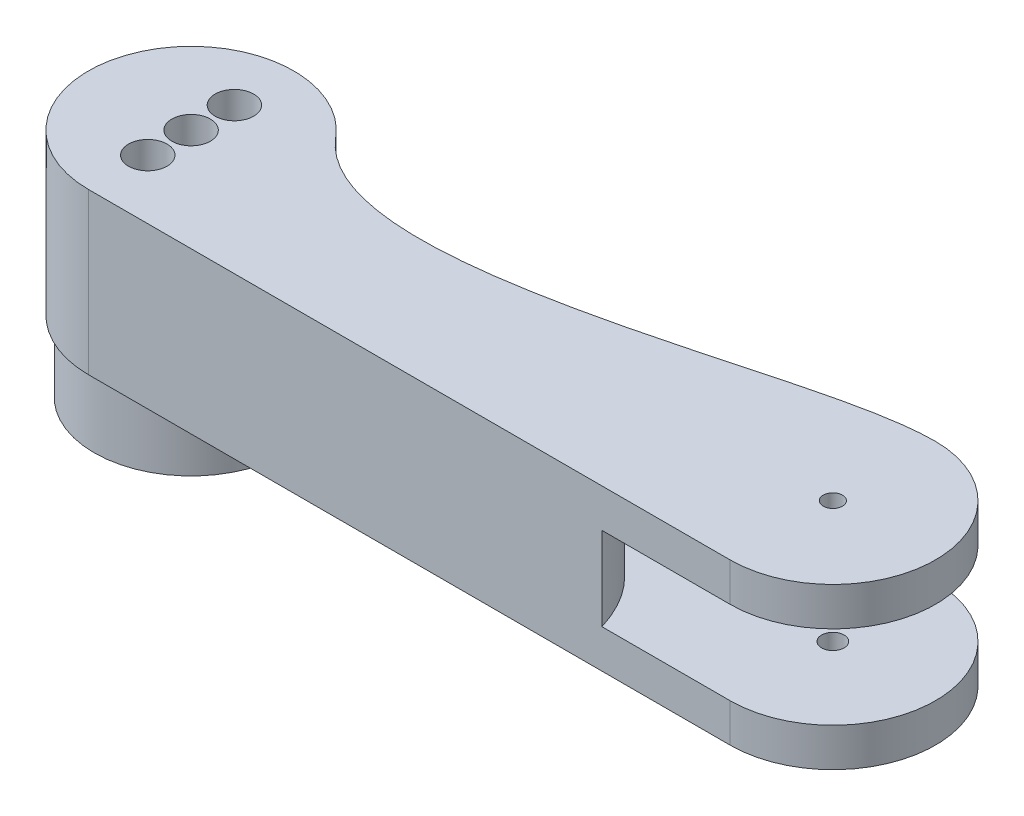
ISO-10303-21;
HEADER;
FILE_DESCRIPTION(('STEP AP214'),'2;1');
FILE_NAME('part.step','',(''),(''),'','','');
FILE_SCHEMA(('AUTOMOTIVE_DESIGN { 1 0 10303 214 1 1 1 1 }'));
ENDSEC;
DATA;
#1=APPLICATION_CONTEXT('core data for automotive mechanical design processes');
#2=APPLICATION_PROTOCOL_DEFINITION('international standard','automotive_design',2000,#1);
#3=PRODUCT_CONTEXT('',#1,'mechanical');
#4=PRODUCT('Part','Part','',(#3));
#5=PRODUCT_RELATED_PRODUCT_CATEGORY('part','',(#4));
#6=PRODUCT_DEFINITION_FORMATION('','',#4);
#7=PRODUCT_DEFINITION_CONTEXT('part definition',#1,'design');
#8=PRODUCT_DEFINITION('design','',#6,#7);
#9=PRODUCT_DEFINITION_SHAPE('','',#8);
#10=(LENGTH_UNIT() NAMED_UNIT(*) SI_UNIT(.MILLI.,.METRE.));
#11=(NAMED_UNIT(*) PLANE_ANGLE_UNIT() SI_UNIT($,.RADIAN.));
#12=(NAMED_UNIT(*) SI_UNIT($,.STERADIAN.) SOLID_ANGLE_UNIT());
#13=UNCERTAINTY_MEASURE_WITH_UNIT(LENGTH_MEASURE(1.E-05),#10,'distance_accuracy_value','');
#14=(GEOMETRIC_REPRESENTATION_CONTEXT(3) GLOBAL_UNCERTAINTY_ASSIGNED_CONTEXT((#13)) GLOBAL_UNIT_ASSIGNED_CONTEXT((#10,
#11,#12)) REPRESENTATION_CONTEXT('',''));
#15=CARTESIAN_POINT('',(0.,0.,0.));
#16=DIRECTION('',(0.,0.,1.));
#17=DIRECTION('',(1.,0.,0.));
#18=AXIS2_PLACEMENT_3D('',#15,#16,#17);
#19=CARTESIAN_POINT('',(-50.,6.,0.));
#20=DIRECTION('',(0.,1.,0.));
#21=DIRECTION('',(0.,0.,-1.));
#22=AXIS2_PLACEMENT_3D('',#19,#20,#21);
#23=PLANE('',#22);
#24=CARTESIAN_POINT('',(50.,6.,0.));
#25=DIRECTION('',(0.,1.,0.));
#26=DIRECTION('',(0.,0.,1.));
#27=AXIS2_PLACEMENT_3D('',#24,#25,#26);
#28=CIRCLE('',#27,1.75);
#29=CARTESIAN_POINT('',(50.,6.,1.75000000000002));
#30=VERTEX_POINT('',#29);
#31=EDGE_CURVE('E248',#30,#30,#28,.T.);
#32=ORIENTED_EDGE('',*,*,#31,.F.);
#33=EDGE_LOOP('',(#32));
#34=FACE_BOUND('',#33,.T.);
#35=CARTESIAN_POINT('',(-34.2856764118283,6.,-16.));
#36=CARTESIAN_POINT('',(-23.6762783257379,6.,6.11814593544332));
#37=CARTESIAN_POINT('',(21.9928600173767,6.,-10.8621580125102));
#38=CARTESIAN_POINT('',(30.,6.,16.));
#39=B_SPLINE_CURVE_WITH_KNOTS('',3,(#35,#36,#37,#38),.UNSPECIFIED.,.F.,.F.,(4,4),(0.,1.),.UNSPECIFIED.);
#40=CARTESIAN_POINT('',(-12.0743102711399,6.,-3.35363574440017));
#41=VERTEX_POINT('',#40);
#42=CARTESIAN_POINT('',(30.,6.,16.));
#43=VERTEX_POINT('',#42);
#44=EDGE_CURVE('E206',#41,#43,#39,.T.);
#45=ORIENTED_EDGE('',*,*,#44,.T.);
#46=DIRECTION('',(-1.,0.,0.));
#47=VECTOR('',#46,1.);
#48=CARTESIAN_POINT('',(-50.,6.,16.));
#49=LINE('',#48,#47);
#50=CARTESIAN_POINT('',(50.,6.,16.));
#51=VERTEX_POINT('',#50);
#52=EDGE_CURVE('E236',#51,#43,#49,.T.);
#53=ORIENTED_EDGE('',*,*,#52,.F.);
#54=CARTESIAN_POINT('',(50.,6.,0.));
#55=DIRECTION('',(0.,-1.,0.));
#56=DIRECTION('',(0.,0.,-1.));
#57=AXIS2_PLACEMENT_3D('',#54,#55,#56);
#58=CIRCLE('',#57,16.);
#59=CARTESIAN_POINT('',(50.,6.,-16.));
#60=VERTEX_POINT('',#59);
#61=EDGE_CURVE('E240',#60,#51,#58,.T.);
#62=ORIENTED_EDGE('',*,*,#61,.F.);
#63=CARTESIAN_POINT('',(-37.7312638091283,6.,-10.2702537592211));
#64=CARTESIAN_POINT('',(-30.3325567034885,6.,-1.43183673850021));
#65=CARTESIAN_POINT('',(6.05040288848306,6.,-3.36458797267431));
#66=CARTESIAN_POINT('',(38.5122315829498,6.,-16.));
#67=CARTESIAN_POINT('',(50.,6.,-16.));
#68=B_SPLINE_CURVE_WITH_KNOTS('',3,(#63,#64,#65,#66,#67),.UNSPECIFIED.,.F.,.F.,(4,1,4),(0.,
0.426660682996785,1.),.UNSPECIFIED.);
#69=EDGE_CURVE('E125',#60,#41,#68,.F.);
#70=ORIENTED_EDGE('',*,*,#69,.T.);
#71=EDGE_LOOP('',(#45,#53,#62,#70));
#72=FACE_BOUND('',#71,.T.);
#73=ADVANCED_FACE('F43',(#34,#72),#23,.T.);
#74=CARTESIAN_POINT('',(-50.,0.,0.));
#75=DIRECTION('',(0.,1.,0.));
#76=DIRECTION('',(0.,0.,-1.));
#77=AXIS2_PLACEMENT_3D('',#74,#75,#76);
#78=PLANE('',#77);
#79=CARTESIAN_POINT('',(-50.,0.,0.));
#80=DIRECTION('',(0.,-1.,0.));
#81=DIRECTION('',(0.,0.,-1.));
#82=AXIS2_PLACEMENT_3D('',#79,#80,#81);
#83=CIRCLE('',#82,15.1);
#84=CARTESIAN_POINT('',(-50.,0.,-15.1));
#85=VERTEX_POINT('',#84);
#86=EDGE_CURVE('E11',#85,#85,#83,.F.);
#87=ORIENTED_EDGE('',*,*,#86,.T.);
#88=EDGE_LOOP('',(#87));
#89=FACE_BOUND('',#88,.T.);
#90=CARTESIAN_POINT('',(50.,0.,0.));
#91=DIRECTION('',(0.,1.,0.));
#92=DIRECTION('',(0.,0.,1.));
#93=AXIS2_PLACEMENT_3D('',#90,#91,#92);
#94=CIRCLE('',#93,1.75);
#95=CARTESIAN_POINT('',(50.,0.,1.75000000000002));
#96=VERTEX_POINT('',#95);
#97=EDGE_CURVE('E237',#96,#96,#94,.T.);
#98=ORIENTED_EDGE('',*,*,#97,.T.);
#99=EDGE_LOOP('',(#98));
#100=FACE_BOUND('',#99,.T.);
#101=CARTESIAN_POINT('',(-37.7312638091283,0.,-10.2702537592211));
#102=CARTESIAN_POINT('',(-30.3325567034885,0.,-1.43183673850021));
#103=CARTESIAN_POINT('',(6.05040288848306,0.,-3.36458797267431));
#104=CARTESIAN_POINT('',(38.5122315829498,0.,-16.));
#105=CARTESIAN_POINT('',(50.,0.,-16.));
#106=B_SPLINE_CURVE_WITH_KNOTS('',3,(#101,#102,#103,#104,#105),.UNSPECIFIED.,.F.,.F.,(4,1,4),
(0.,0.426660682996785,1.),.UNSPECIFIED.);
#107=CARTESIAN_POINT('',(50.,0.,-16.));
#108=VERTEX_POINT('',#107);
#109=CARTESIAN_POINT('',(-37.7312638091283,0.,-10.2702537592211));
#110=VERTEX_POINT('',#109);
#111=EDGE_CURVE('E123',#108,#110,#106,.F.);
#112=ORIENTED_EDGE('',*,*,#111,.F.);
#113=CARTESIAN_POINT('',(50.,0.,0.));
#114=DIRECTION('',(0.,-1.,0.));
#115=DIRECTION('',(0.,0.,-1.));
#116=AXIS2_PLACEMENT_3D('',#113,#114,#115);
#117=CIRCLE('',#116,16.);
#118=CARTESIAN_POINT('',(50.,0.,16.));
#119=VERTEX_POINT('',#118);
#120=EDGE_CURVE('E129',#108,#119,#117,.T.);
#121=ORIENTED_EDGE('',*,*,#120,.T.);
#122=DIRECTION('',(-1.,0.,0.));
#123=VECTOR('',#122,1.);
#124=CARTESIAN_POINT('',(-50.,0.,16.));
#125=LINE('',#124,#123);
#126=CARTESIAN_POINT('',(-50.,0.,16.));
#127=VERTEX_POINT('',#126);
#128=EDGE_CURVE('E133',#119,#127,#125,.T.);
#129=ORIENTED_EDGE('',*,*,#128,.T.);
#130=CARTESIAN_POINT('',(-50.,0.,0.));
#131=DIRECTION('',(0.,-1.,0.));
#132=DIRECTION('',(0.,0.,-1.));
#133=AXIS2_PLACEMENT_3D('',#130,#131,#132);
#134=CIRCLE('',#133,16.);
#135=EDGE_CURVE('E134',#127,#110,#134,.T.);
#136=ORIENTED_EDGE('',*,*,#135,.T.);
#137=EDGE_LOOP('',(#112,#121,#129,#136));
#138=FACE_BOUND('',#137,.T.);
#139=ADVANCED_FACE('F137',(#89,#100,#138),#78,.F.);
#140=CARTESIAN_POINT('',(-34.2856764118283,19.,-16.));
#141=CARTESIAN_POINT('',(-23.6762783257379,19.,6.11814593544332));
#142=CARTESIAN_POINT('',(21.9928600173767,19.,-10.8621580125102));
#143=CARTESIAN_POINT('',(30.,19.,16.));
#144=B_SPLINE_CURVE_WITH_KNOTS('',3,(#140,#141,#142,#143),.UNSPECIFIED.,.F.,.F.,(4,4),(0.,1.),.UNSPECIFIED.);
#145=DIRECTION('',(0.,-1.,0.));
#146=VECTOR('',#145,1.);
#147=SURFACE_OF_LINEAR_EXTRUSION('',#144,#146);
#148=DIRECTION('',(0.,-1.,0.));
#149=VECTOR('',#148,1.);
#150=CARTESIAN_POINT('',(-12.0743102711399,19.,-3.35363574440017));
#151=LINE('',#150,#149);
#152=CARTESIAN_POINT('',(-12.074310274312,19.,-3.35363574415139));
#153=VERTEX_POINT('',#152);
#154=EDGE_CURVE('E142',#153,#41,#151,.T.);
#155=ORIENTED_EDGE('',*,*,#154,.F.);
#156=CARTESIAN_POINT('',(30.,19.,16.));
#157=VERTEX_POINT('',#156);
#158=EDGE_CURVE('E204',#153,#157,#144,.T.);
#159=ORIENTED_EDGE('',*,*,#158,.T.);
#160=DIRECTION('',(0.,-1.,0.));
#161=VECTOR('',#160,1.);
#162=CARTESIAN_POINT('',(30.,19.,16.));
#163=LINE('',#162,#161);
#164=EDGE_CURVE('E84',#157,#43,#163,.T.);
#165=ORIENTED_EDGE('',*,*,#164,.T.);
#166=ORIENTED_EDGE('',*,*,#44,.F.);
#167=EDGE_LOOP('',(#155,#159,#165,#166));
#168=FACE_BOUND('',#167,.T.);
#169=ADVANCED_FACE('F200',(#168),#147,.T.);
#170=CARTESIAN_POINT('',(-50.,19.,0.));
#171=DIRECTION('',(0.,1.,0.));
#172=DIRECTION('',(0.,0.,-1.));
#173=AXIS2_PLACEMENT_3D('',#170,#171,#172);
#174=PLANE('',#173);
#175=CARTESIAN_POINT('',(50.,19.,0.));
#176=DIRECTION('',(0.,-1.,0.));
#177=DIRECTION('',(0.,0.,-1.));
#178=AXIS2_PLACEMENT_3D('',#175,#176,#177);
#179=CIRCLE('',#178,1.5);
#180=CARTESIAN_POINT('',(50.,19.,-1.49999999999999));
#181=VERTEX_POINT('',#180);
#182=EDGE_CURVE('E170',#181,#181,#179,.F.);
#183=ORIENTED_EDGE('',*,*,#182,.T.);
#184=EDGE_LOOP('',(#183));
#185=FACE_BOUND('',#184,.T.);
#186=CARTESIAN_POINT('',(-37.7312638091283,19.,-10.2702537592211));
#187=CARTESIAN_POINT('',(-30.3325567034885,19.,-1.43183673850021));
#188=CARTESIAN_POINT('',(6.05040288848306,19.,-3.36458797267431));
#189=CARTESIAN_POINT('',(38.5122315829498,19.,-16.));
#190=CARTESIAN_POINT('',(50.,19.,-16.));
#191=B_SPLINE_CURVE_WITH_KNOTS('',3,(#186,#187,#188,#189,#190),.UNSPECIFIED.,.F.,.F.,(4,1,4),
(0.,0.426660682996785,1.),.UNSPECIFIED.);
#192=CARTESIAN_POINT('',(50.,19.,-16.));
#193=VERTEX_POINT('',#192);
#194=EDGE_CURVE('E139',#193,#153,#191,.F.);
#195=ORIENTED_EDGE('',*,*,#194,.F.);
#196=CARTESIAN_POINT('',(50.,19.,0.));
#197=DIRECTION('',(0.,-1.,0.));
#198=DIRECTION('',(0.,0.,-1.));
#199=AXIS2_PLACEMENT_3D('',#196,#197,#198);
#200=CIRCLE('',#199,16.);
#201=CARTESIAN_POINT('',(50.,19.,16.));
#202=VERTEX_POINT('',#201);
#203=EDGE_CURVE('E173',#193,#202,#200,.T.);
#204=ORIENTED_EDGE('',*,*,#203,.T.);
#205=DIRECTION('',(-1.,0.,0.));
#206=VECTOR('',#205,1.);
#207=CARTESIAN_POINT('',(-50.,19.,16.));
#208=LINE('',#207,#206);
#209=EDGE_CURVE('E91',#202,#157,#208,.T.);
#210=ORIENTED_EDGE('',*,*,#209,.T.);
#211=ORIENTED_EDGE('',*,*,#158,.F.);
#212=EDGE_LOOP('',(#195,#204,#210,#211));
#213=FACE_BOUND('',#212,.T.);
#214=ADVANCED_FACE('F229',(#185,#213),#174,.F.);
#215=CARTESIAN_POINT('',(-50.,25.,0.));
#216=DIRECTION('',(0.,1.,0.));
#217=DIRECTION('',(0.,0.,-1.));
#218=AXIS2_PLACEMENT_3D('',#215,#216,#217);
#219=PLANE('',#218);
#220=CARTESIAN_POINT('',(-50.,25.,-6.75));
#221=DIRECTION('',(0.,-1.,0.));
#222=DIRECTION('',(0.,0.,-1.));
#223=AXIS2_PLACEMENT_3D('',#220,#221,#222);
#224=CIRCLE('',#223,3.);
#225=CARTESIAN_POINT('',(-50.,25.,-9.75));
#226=VERTEX_POINT('',#225);
#227=EDGE_CURVE('E474',#226,#226,#224,.F.);
#228=ORIENTED_EDGE('',*,*,#227,.F.);
#229=EDGE_LOOP('',(#228));
#230=FACE_BOUND('',#229,.T.);
#231=CARTESIAN_POINT('',(-49.9999999999995,25.,6.75));
#232=DIRECTION('',(0.,-1.,0.));
#233=DIRECTION('',(0.,0.,-1.));
#234=AXIS2_PLACEMENT_3D('',#231,#232,#233);
#235=CIRCLE('',#234,3.);
#236=CARTESIAN_POINT('',(-49.9999999999995,25.,3.75));
#237=VERTEX_POINT('',#236);
#238=EDGE_CURVE('E479',#237,#237,#235,.F.);
#239=ORIENTED_EDGE('',*,*,#238,.F.);
#240=EDGE_LOOP('',(#239));
#241=FACE_BOUND('',#240,.T.);
#242=CARTESIAN_POINT('',(-50.,25.,0.));
#243=DIRECTION('',(0.,-1.,0.));
#244=DIRECTION('',(0.,0.,-1.));
#245=AXIS2_PLACEMENT_3D('',#242,#243,#244);
#246=CIRCLE('',#245,3.);
#247=CARTESIAN_POINT('',(-50.,25.,-3.));
#248=VERTEX_POINT('',#247);
#249=EDGE_CURVE('E487',#248,#248,#246,.F.);
#250=ORIENTED_EDGE('',*,*,#249,.F.);
#251=EDGE_LOOP('',(#250));
#252=FACE_BOUND('',#251,.T.);
#253=CARTESIAN_POINT('',(50.,25.,0.));
#254=DIRECTION('',(0.,-1.,0.));
#255=DIRECTION('',(0.,0.,-1.));
#256=AXIS2_PLACEMENT_3D('',#253,#254,#255);
#257=CIRCLE('',#256,1.5);
#258=CARTESIAN_POINT('',(50.,25.,-1.49999999999999));
#259=VERTEX_POINT('',#258);
#260=EDGE_CURVE('E167',#259,#259,#257,.T.);
#261=ORIENTED_EDGE('',*,*,#260,.T.);
#262=EDGE_LOOP('',(#261));
#263=FACE_BOUND('',#262,.T.);
#264=CARTESIAN_POINT('',(-50.,25.,0.));
#265=DIRECTION('',(0.,-1.,0.));
#266=DIRECTION('',(0.,0.,-1.));
#267=AXIS2_PLACEMENT_3D('',#264,#265,#266);
#268=CIRCLE('',#267,16.);
#269=CARTESIAN_POINT('',(-50.,25.,16.));
#270=VERTEX_POINT('',#269);
#271=CARTESIAN_POINT('',(-37.7312638091283,25.,-10.2702537592211));
#272=VERTEX_POINT('',#271);
#273=EDGE_CURVE('E174',#270,#272,#268,.T.);
#274=ORIENTED_EDGE('',*,*,#273,.F.);
#275=DIRECTION('',(-1.,0.,0.));
#276=VECTOR('',#275,1.);
#277=CARTESIAN_POINT('',(-50.,25.,16.));
#278=LINE('',#277,#276);
#279=CARTESIAN_POINT('',(50.,25.,16.));
#280=VERTEX_POINT('',#279);
#281=EDGE_CURVE('E180',#280,#270,#278,.T.);
#282=ORIENTED_EDGE('',*,*,#281,.F.);
#283=CARTESIAN_POINT('',(50.,25.,0.));
#284=DIRECTION('',(0.,-1.,0.));
#285=DIRECTION('',(0.,0.,-1.));
#286=AXIS2_PLACEMENT_3D('',#283,#284,#285);
#287=CIRCLE('',#286,16.);
#288=CARTESIAN_POINT('',(50.,25.,-16.));
#289=VERTEX_POINT('',#288);
#290=EDGE_CURVE('E177',#289,#280,#287,.T.);
#291=ORIENTED_EDGE('',*,*,#290,.F.);
#292=CARTESIAN_POINT('',(-37.7312638091283,25.,-10.2702537592211));
#293=CARTESIAN_POINT('',(-30.3325567034885,25.,-1.43183673850021));
#294=CARTESIAN_POINT('',(6.05040288848306,25.,-3.36458797267431));
#295=CARTESIAN_POINT('',(38.5122315829498,25.,-16.));
#296=CARTESIAN_POINT('',(50.,25.,-16.));
#297=B_SPLINE_CURVE_WITH_KNOTS('',3,(#292,#293,#294,#295,#296),.UNSPECIFIED.,.F.,.F.,(4,1,4),
(0.,0.426660682996785,1.),.UNSPECIFIED.);
#298=EDGE_CURVE('E214',#272,#289,#297,.T.);
#299=ORIENTED_EDGE('',*,*,#298,.F.);
#300=EDGE_LOOP('',(#274,#282,#291,#299));
#301=FACE_BOUND('',#300,.T.);
#302=ADVANCED_FACE('F258',(#230,#241,#252,#263,#301),#219,.T.);
#303=CARTESIAN_POINT('',(-50.,6.,0.));
#304=DIRECTION('',(0.,-1.,0.));
#305=DIRECTION('',(0.,0.,1.));
#306=AXIS2_PLACEMENT_3D('',#303,#304,#305);
#307=CYLINDRICAL_SURFACE('',#306,16.);
#308=ORIENTED_EDGE('',*,*,#135,.F.);
#309=DIRECTION('',(0.,-1.,0.));
#310=VECTOR('',#309,1.);
#311=CARTESIAN_POINT('',(-50.,6.,16.));
#312=LINE('',#311,#310);
#313=EDGE_CURVE('E242',#270,#127,#312,.T.);
#314=ORIENTED_EDGE('',*,*,#313,.F.);
#315=ORIENTED_EDGE('',*,*,#273,.T.);
#316=DIRECTION('',(0.,1.,0.));
#317=VECTOR('',#316,1.);
#318=CARTESIAN_POINT('',(-37.7312638091283,-0.001000000000001,-10.2702537592211));
#319=LINE('',#318,#317);
#320=EDGE_CURVE('E59',#110,#272,#319,.T.);
#321=ORIENTED_EDGE('',*,*,#320,.F.);
#322=EDGE_LOOP('',(#308,#314,#315,#321));
#323=FACE_BOUND('',#322,.T.);
#324=ADVANCED_FACE('F45',(#323),#307,.T.);
#325=CARTESIAN_POINT('',(50.,6.,0.));
#326=DIRECTION('',(0.,-1.,0.));
#327=DIRECTION('',(0.,0.,1.));
#328=AXIS2_PLACEMENT_3D('',#325,#326,#327);
#329=CYLINDRICAL_SURFACE('',#328,16.);
#330=ORIENTED_EDGE('',*,*,#120,.F.);
#331=DIRECTION('',(0.,-1.,0.));
#332=VECTOR('',#331,1.);
#333=CARTESIAN_POINT('',(50.,6.,-16.));
#334=LINE('',#333,#332);
#335=EDGE_CURVE('E52',#60,#108,#334,.T.);
#336=ORIENTED_EDGE('',*,*,#335,.F.);
#337=ORIENTED_EDGE('',*,*,#61,.T.);
#338=DIRECTION('',(0.,-1.,0.));
#339=VECTOR('',#338,1.);
#340=CARTESIAN_POINT('',(50.,6.,16.));
#341=LINE('',#340,#339);
#342=EDGE_CURVE('E68',#51,#119,#341,.T.);
#343=ORIENTED_EDGE('',*,*,#342,.T.);
#344=EDGE_LOOP('',(#330,#336,#337,#343));
#345=FACE_BOUND('',#344,.T.);
#346=ADVANCED_FACE('F130',(#345),#329,.T.);
#347=CARTESIAN_POINT('',(-50.,6.,16.));
#348=DIRECTION('',(0.,0.,-1.));
#349=DIRECTION('',(1.,0.,0.));
#350=AXIS2_PLACEMENT_3D('',#347,#348,#349);
#351=PLANE('',#350);
#352=ORIENTED_EDGE('',*,*,#128,.F.);
#353=ORIENTED_EDGE('',*,*,#342,.F.);
#354=ORIENTED_EDGE('',*,*,#52,.T.);
#355=ORIENTED_EDGE('',*,*,#164,.F.);
#356=ORIENTED_EDGE('',*,*,#209,.F.);
#357=DIRECTION('',(0.,-1.,0.));
#358=VECTOR('',#357,1.);
#359=CARTESIAN_POINT('',(50.,25.,16.));
#360=LINE('',#359,#358);
#361=EDGE_CURVE('E183',#280,#202,#360,.T.);
#362=ORIENTED_EDGE('',*,*,#361,.F.);
#363=ORIENTED_EDGE('',*,*,#281,.T.);
#364=ORIENTED_EDGE('',*,*,#313,.T.);
#365=EDGE_LOOP('',(#352,#353,#354,#355,#356,#362,#363,#364));
#366=FACE_BOUND('',#365,.T.);
#367=ADVANCED_FACE('F234',(#366),#351,.F.);
#368=CARTESIAN_POINT('',(50.,6.,0.));
#369=DIRECTION('',(0.,-1.,0.));
#370=DIRECTION('',(0.,0.,1.));
#371=AXIS2_PLACEMENT_3D('',#368,#369,#370);
#372=CYLINDRICAL_SURFACE('',#371,1.75);
#373=ORIENTED_EDGE('',*,*,#31,.T.);
#374=EDGE_LOOP('',(#373));
#375=FACE_BOUND('',#374,.T.);
#376=ORIENTED_EDGE('',*,*,#97,.F.);
#377=EDGE_LOOP('',(#376));
#378=FACE_BOUND('',#377,.T.);
#379=ADVANCED_FACE('F280',(#375,#378),#372,.F.);
#380=CARTESIAN_POINT('',(50.,25.,0.));
#381=DIRECTION('',(0.,-1.,0.));
#382=DIRECTION('',(0.,0.,1.));
#383=AXIS2_PLACEMENT_3D('',#380,#381,#382);
#384=CYLINDRICAL_SURFACE('',#383,16.);
#385=ORIENTED_EDGE('',*,*,#203,.F.);
#386=DIRECTION('',(0.,-1.,0.));
#387=VECTOR('',#386,1.);
#388=CARTESIAN_POINT('',(50.,25.,-16.));
#389=LINE('',#388,#387);
#390=EDGE_CURVE('E186',#289,#193,#389,.T.);
#391=ORIENTED_EDGE('',*,*,#390,.F.);
#392=ORIENTED_EDGE('',*,*,#290,.T.);
#393=ORIENTED_EDGE('',*,*,#361,.T.);
#394=EDGE_LOOP('',(#385,#391,#392,#393));
#395=FACE_BOUND('',#394,.T.);
#396=ADVANCED_FACE('F231',(#395),#384,.T.);
#397=CARTESIAN_POINT('',(50.,-0.001000000000001,0.));
#398=DIRECTION('',(0.,1.,0.));
#399=DIRECTION('',(0.,0.,-1.));
#400=AXIS2_PLACEMENT_3D('',#397,#398,#399);
#401=CYLINDRICAL_SURFACE('',#400,1.5);
#402=ORIENTED_EDGE('',*,*,#260,.F.);
#403=EDGE_LOOP('',(#402));
#404=FACE_BOUND('',#403,.T.);
#405=ORIENTED_EDGE('',*,*,#182,.F.);
#406=EDGE_LOOP('',(#405));
#407=FACE_BOUND('',#406,.T.);
#408=ADVANCED_FACE('F308',(#404,#407),#401,.F.);
#409=CARTESIAN_POINT('',(-37.7312638091283,-0.000999999999997531,-10.2702537592211));
#410=CARTESIAN_POINT('',(-30.3325567034885,-0.000999999999997531,-1.43183673850021));
#411=CARTESIAN_POINT('',(6.05040288848306,-0.000999999999997531,-3.36458797267431));
#412=CARTESIAN_POINT('',(38.5122315829498,-0.000999999999997531,-16.));
#413=CARTESIAN_POINT('',(50.,-0.000999999999997531,-16.));
#414=B_SPLINE_CURVE_WITH_KNOTS('',3,(#409,#410,#411,#412,#413),.UNSPECIFIED.,.F.,.F.,(4,1,4),
(0.,0.426660682996785,1.),.UNSPECIFIED.);
#415=DIRECTION('',(0.,1.,0.));
#416=VECTOR('',#415,1.);
#417=SURFACE_OF_LINEAR_EXTRUSION('',#414,#416);
#418=ORIENTED_EDGE('',*,*,#335,.T.);
#419=ORIENTED_EDGE('',*,*,#111,.T.);
#420=ORIENTED_EDGE('',*,*,#320,.T.);
#421=ORIENTED_EDGE('',*,*,#298,.T.);
#422=ORIENTED_EDGE('',*,*,#390,.T.);
#423=ORIENTED_EDGE('',*,*,#194,.T.);
#424=ORIENTED_EDGE('',*,*,#154,.T.);
#425=ORIENTED_EDGE('',*,*,#69,.F.);
#426=EDGE_LOOP('',(#418,#419,#420,#421,#422,#423,#424,#425));
#427=FACE_BOUND('',#426,.T.);
#428=ADVANCED_FACE('F121',(#427),#417,.F.);
#429=CARTESIAN_POINT('',(-50.,-11.,0.));
#430=DIRECTION('',(0.,1.,0.));
#431=DIRECTION('',(0.,0.,-1.));
#432=AXIS2_PLACEMENT_3D('',#429,#430,#431);
#433=CYLINDRICAL_SURFACE('',#432,15.1);
#434=CARTESIAN_POINT('',(-50.,-11.,0.));
#435=DIRECTION('',(0.,1.,0.));
#436=DIRECTION('',(0.,0.,1.));
#437=AXIS2_PLACEMENT_3D('',#434,#435,#436);
#438=CIRCLE('',#437,15.1);
#439=CARTESIAN_POINT('',(-50.,-11.,15.1));
#440=VERTEX_POINT('',#439);
#441=EDGE_CURVE('E140',#440,#440,#438,.T.);
#442=ORIENTED_EDGE('',*,*,#441,.T.);
#443=EDGE_LOOP('',(#442));
#444=FACE_BOUND('',#443,.T.);
#445=ORIENTED_EDGE('',*,*,#86,.F.);
#446=EDGE_LOOP('',(#445));
#447=FACE_BOUND('',#446,.T.);
#448=ADVANCED_FACE('F322',(#444,#447),#433,.T.);
#449=CARTESIAN_POINT('',(-50.,-11.,0.));
#450=DIRECTION('',(0.,-1.,0.));
#451=DIRECTION('',(0.,0.,1.));
#452=AXIS2_PLACEMENT_3D('',#449,#450,#451);
#453=PLANE('',#452);
#454=CARTESIAN_POINT('',(-50.,-11.,0.));
#455=DIRECTION('',(0.,1.,0.));
#456=DIRECTION('',(0.,0.,1.));
#457=AXIS2_PLACEMENT_3D('',#454,#455,#456);
#458=CIRCLE('',#457,3.);
#459=CARTESIAN_POINT('',(-50.,-11.,-3.));
#460=VERTEX_POINT('',#459);
#461=EDGE_CURVE('E47',#460,#460,#458,.F.);
#462=ORIENTED_EDGE('',*,*,#461,.F.);
#463=EDGE_LOOP('',(#462));
#464=FACE_BOUND('',#463,.T.);
#465=CARTESIAN_POINT('',(-50.,-11.,-6.75));
#466=DIRECTION('',(0.,1.,0.));
#467=DIRECTION('',(0.,0.,1.));
#468=AXIS2_PLACEMENT_3D('',#465,#466,#467);
#469=CIRCLE('',#468,1.75);
#470=CARTESIAN_POINT('',(-50.,-11.,-5.));
#471=VERTEX_POINT('',#470);
#472=EDGE_CURVE('E145',#471,#471,#469,.T.);
#473=ORIENTED_EDGE('',*,*,#472,.T.);
#474=EDGE_LOOP('',(#473));
#475=FACE_BOUND('',#474,.T.);
#476=CARTESIAN_POINT('',(-50.,-11.,6.75));
#477=DIRECTION('',(0.,1.,0.));
#478=DIRECTION('',(0.,0.,1.));
#479=AXIS2_PLACEMENT_3D('',#476,#477,#478);
#480=CIRCLE('',#479,1.75);
#481=CARTESIAN_POINT('',(-50.,-11.,8.5));
#482=VERTEX_POINT('',#481);
#483=EDGE_CURVE('E492',#482,#482,#480,.T.);
#484=ORIENTED_EDGE('',*,*,#483,.T.);
#485=EDGE_LOOP('',(#484));
#486=FACE_BOUND('',#485,.T.);
#487=ORIENTED_EDGE('',*,*,#441,.F.);
#488=EDGE_LOOP('',(#487));
#489=FACE_BOUND('',#488,.T.);
#490=ADVANCED_FACE('F330',(#464,#475,#486,#489),#453,.T.);
#491=CARTESIAN_POINT('',(-50.,-0.999999999999999,6.75));
#492=DIRECTION('',(0.,-1.,0.));
#493=DIRECTION('',(0.,0.,1.));
#494=AXIS2_PLACEMENT_3D('',#491,#492,#493);
#495=CYLINDRICAL_SURFACE('',#494,1.75);
#496=CARTESIAN_POINT('',(-50.,-0.999999999999999,6.75));
#497=DIRECTION('',(0.,1.,0.));
#498=DIRECTION('',(0.,0.,1.));
#499=AXIS2_PLACEMENT_3D('',#496,#497,#498);
#500=CIRCLE('',#499,1.75);
#501=CARTESIAN_POINT('',(-50.,-0.999999999999999,8.5));
#502=VERTEX_POINT('',#501);
#503=EDGE_CURVE('E476',#502,#502,#500,.T.);
#504=ORIENTED_EDGE('',*,*,#503,.T.);
#505=EDGE_LOOP('',(#504));
#506=FACE_BOUND('',#505,.T.);
#507=ORIENTED_EDGE('',*,*,#483,.F.);
#508=EDGE_LOOP('',(#507));
#509=FACE_BOUND('',#508,.T.);
#510=ADVANCED_FACE('F339',(#506,#509),#495,.F.);
#511=CARTESIAN_POINT('',(-50.,-0.999999999999999,-6.75));
#512=DIRECTION('',(0.,-1.,0.));
#513=DIRECTION('',(0.,0.,1.));
#514=AXIS2_PLACEMENT_3D('',#511,#512,#513);
#515=CYLINDRICAL_SURFACE('',#514,1.75);
#516=CARTESIAN_POINT('',(-50.,-0.999999999999999,-6.75));
#517=DIRECTION('',(0.,1.,0.));
#518=DIRECTION('',(0.,0.,1.));
#519=AXIS2_PLACEMENT_3D('',#516,#517,#518);
#520=CIRCLE('',#519,1.75);
#521=CARTESIAN_POINT('',(-50.,-0.999999999999999,-5.));
#522=VERTEX_POINT('',#521);
#523=EDGE_CURVE('E469',#522,#522,#520,.T.);
#524=ORIENTED_EDGE('',*,*,#523,.T.);
#525=EDGE_LOOP('',(#524));
#526=FACE_BOUND('',#525,.T.);
#527=ORIENTED_EDGE('',*,*,#472,.F.);
#528=EDGE_LOOP('',(#527));
#529=FACE_BOUND('',#528,.T.);
#530=ADVANCED_FACE('F348',(#526,#529),#515,.F.);
#531=CARTESIAN_POINT('',(-50.,-11.000012,0.));
#532=DIRECTION('',(0.,1.,0.));
#533=DIRECTION('',(0.,0.,-1.));
#534=AXIS2_PLACEMENT_3D('',#531,#532,#533);
#535=CYLINDRICAL_SURFACE('',#534,3.);
#536=CARTESIAN_POINT('',(-50.,-11.,-3.));
#537=CARTESIAN_POINT('',(-50.,-10.625,-3.));
#538=CARTESIAN_POINT('',(-50.,-10.25,-3.));
#539=CARTESIAN_POINT('',(-50.,-9.5,-3.));
#540=CARTESIAN_POINT('',(-50.,-9.125,-3.));
#541=CARTESIAN_POINT('',(-50.,-8.375,-3.));
#542=CARTESIAN_POINT('',(-50.,-8.,-3.));
#543=CARTESIAN_POINT('',(-50.,-7.25,-3.));
#544=CARTESIAN_POINT('',(-50.,-6.875,-3.));
#545=CARTESIAN_POINT('',(-50.,-6.125,-3.));
#546=CARTESIAN_POINT('',(-50.,-5.75,-3.));
#547=CARTESIAN_POINT('',(-50.,-5.,-3.));
#548=CARTESIAN_POINT('',(-50.,-4.625,-3.));
#549=CARTESIAN_POINT('',(-50.,-3.875,-3.));
#550=CARTESIAN_POINT('',(-50.,-3.5,-3.));
#551=CARTESIAN_POINT('',(-50.,-2.75,-3.));
#552=CARTESIAN_POINT('',(-50.,-2.375,-3.));
#553=CARTESIAN_POINT('',(-50.,-1.625,-3.));
#554=CARTESIAN_POINT('',(-50.,-1.25,-3.));
#555=CARTESIAN_POINT('',(-50.,-0.499999999999999,-3.));
#556=CARTESIAN_POINT('',(-50.,-0.124999999999998,-3.));
#557=CARTESIAN_POINT('',(-50.,0.625000000000002,-3.));
#558=CARTESIAN_POINT('',(-50.,1.,-3.));
#559=CARTESIAN_POINT('',(-50.,1.75,-3.));
#560=CARTESIAN_POINT('',(-50.,2.125,-3.));
#561=CARTESIAN_POINT('',(-50.,2.875,-3.));
#562=CARTESIAN_POINT('',(-50.,3.25,-3.));
#563=CARTESIAN_POINT('',(-50.,4.,-3.));
#564=CARTESIAN_POINT('',(-50.,4.375,-3.));
#565=CARTESIAN_POINT('',(-50.,5.125,-3.));
#566=CARTESIAN_POINT('',(-50.,5.5,-3.));
#567=CARTESIAN_POINT('',(-50.,6.25,-3.));
#568=CARTESIAN_POINT('',(-50.,6.625,-3.));
#569=CARTESIAN_POINT('',(-50.,7.375,-3.));
#570=CARTESIAN_POINT('',(-50.,7.75,-3.));
#571=CARTESIAN_POINT('',(-50.,8.5,-3.));
#572=CARTESIAN_POINT('',(-50.,8.875,-3.));
#573=CARTESIAN_POINT('',(-50.,9.625,-3.));
#574=CARTESIAN_POINT('',(-50.,10.,-3.));
#575=CARTESIAN_POINT('',(-50.,10.75,-3.));
#576=CARTESIAN_POINT('',(-50.,11.125,-3.));
#577=CARTESIAN_POINT('',(-50.,11.875,-3.));
#578=CARTESIAN_POINT('',(-50.,12.25,-3.));
#579=CARTESIAN_POINT('',(-50.,13.,-3.));
#580=CARTESIAN_POINT('',(-50.,13.375,-3.));
#581=CARTESIAN_POINT('',(-50.,14.125,-3.));
#582=CARTESIAN_POINT('',(-50.,14.5,-3.));
#583=CARTESIAN_POINT('',(-50.,15.25,-3.));
#584=CARTESIAN_POINT('',(-50.,15.625,-3.));
#585=CARTESIAN_POINT('',(-50.,16.375,-3.));
#586=CARTESIAN_POINT('',(-50.,16.75,-3.));
#587=CARTESIAN_POINT('',(-50.,17.5,-3.));
#588=CARTESIAN_POINT('',(-50.,17.875,-3.));
#589=CARTESIAN_POINT('',(-50.,18.625,-3.));
#590=CARTESIAN_POINT('',(-50.,19.,-3.));
#591=CARTESIAN_POINT('',(-50.,19.75,-3.));
#592=CARTESIAN_POINT('',(-50.,20.125,-3.));
#593=CARTESIAN_POINT('',(-50.,20.875,-3.));
#594=CARTESIAN_POINT('',(-50.,21.25,-3.));
#595=CARTESIAN_POINT('',(-50.,22.,-3.));
#596=CARTESIAN_POINT('',(-50.,22.375,-3.));
#597=CARTESIAN_POINT('',(-50.,23.125,-3.));
#598=CARTESIAN_POINT('',(-50.,23.5,-3.));
#599=CARTESIAN_POINT('',(-50.,24.25,-3.));
#600=CARTESIAN_POINT('',(-50.,24.625,-3.));
#601=CARTESIAN_POINT('',(-50.,25.,-3.));
#602=B_SPLINE_CURVE_WITH_KNOTS('',3,(#536,#537,#538,#539,#540,#541,#542,#543,#544,#545,#546,
#547,#548,#549,#550,#551,#552,#553,#554,#555,#556,#557,#558,#559,#560,#561,#562,#563,#564,#565,
#566,#567,#568,#569,#570,#571,#572,#573,#574,#575,#576,#577,#578,#579,#580,#581,#582,#583,#584,
#585,#586,#587,#588,#589,#590,#591,#592,#593,#594,#595,#596,#597,#598,#599,#600,#601),
.UNSPECIFIED.,.F.,.F.,(4,2,2,2,2,2,2,2,2,2,2,2,2,2,2,2,2,2,2,2,2,2,2,2,2,2,2,2,2,2,2,2,4),(0.,
1.125,2.25,3.375,4.5,5.625,6.75,7.875,9.,10.125,11.25,12.375,13.5,14.625,15.75,16.875,18.,
19.125,20.25,21.375,22.5,23.625,24.75,25.875,27.,28.125,29.25,30.375,31.5,32.625,33.75,34.875,
36.),.UNSPECIFIED.);
#603=EDGE_CURVE('BSEAM357',#460,#248,#602,.T.);
#604=ORIENTED_EDGE('',*,*,#461,.T.);
#605=ORIENTED_EDGE('',*,*,#249,.T.);
#606=ORIENTED_EDGE('',*,*,#603,.T.);
#607=ORIENTED_EDGE('',*,*,#603,.F.);
#608=EDGE_LOOP('',(#604,#606,#605,#607));
#609=FACE_BOUND('',#608,.T.);
#610=ADVANCED_FACE('F357',(#609),#535,.F.);
#611=CARTESIAN_POINT('',(-49.9999999999995,25.001025,6.75));
#612=DIRECTION('',(0.,-1.,0.));
#613=DIRECTION('',(0.,0.,1.));
#614=AXIS2_PLACEMENT_3D('',#611,#612,#613);
#615=CYLINDRICAL_SURFACE('',#614,3.);
#616=ORIENTED_EDGE('',*,*,#238,.T.);
#617=EDGE_LOOP('',(#616));
#618=FACE_BOUND('',#617,.T.);
#619=CARTESIAN_POINT('',(-49.9999999999995,-0.999999999999999,6.75));
#620=DIRECTION('',(0.,1.,0.));
#621=DIRECTION('',(0.,0.,1.));
#622=AXIS2_PLACEMENT_3D('',#619,#620,#621);
#623=CIRCLE('',#622,3.);
#624=CARTESIAN_POINT('',(-49.9999999999995,-0.999999999999999,9.75));
#625=VERTEX_POINT('',#624);
#626=EDGE_CURVE('E484',#625,#625,#623,.T.);
#627=ORIENTED_EDGE('',*,*,#626,.F.);
#628=EDGE_LOOP('',(#627));
#629=FACE_BOUND('',#628,.T.);
#630=ADVANCED_FACE('F366',(#618,#629),#615,.F.);
#631=CARTESIAN_POINT('',(-49.9999999999995,-0.999999999999999,6.75));
#632=DIRECTION('',(0.,-1.,0.));
#633=DIRECTION('',(0.,0.,1.));
#634=AXIS2_PLACEMENT_3D('',#631,#632,#633);
#635=PLANE('',#634);
#636=ORIENTED_EDGE('',*,*,#503,.F.);
#637=EDGE_LOOP('',(#636));
#638=FACE_BOUND('',#637,.T.);
#639=ORIENTED_EDGE('',*,*,#626,.T.);
#640=EDGE_LOOP('',(#639));
#641=FACE_BOUND('',#640,.T.);
#642=ADVANCED_FACE('F375',(#638,#641),#635,.F.);
#643=CARTESIAN_POINT('',(-50.,25.001025,-6.75));
#644=DIRECTION('',(0.,-1.,0.));
#645=DIRECTION('',(0.,0.,1.));
#646=AXIS2_PLACEMENT_3D('',#643,#644,#645);
#647=CYLINDRICAL_SURFACE('',#646,3.);
#648=ORIENTED_EDGE('',*,*,#227,.T.);
#649=EDGE_LOOP('',(#648));
#650=FACE_BOUND('',#649,.T.);
#651=CARTESIAN_POINT('',(-50.,-0.999999999999999,-6.75));
#652=DIRECTION('',(0.,1.,0.));
#653=DIRECTION('',(0.,0.,1.));
#654=AXIS2_PLACEMENT_3D('',#651,#652,#653);
#655=CIRCLE('',#654,3.);
#656=CARTESIAN_POINT('',(-50.,-0.999999999999999,-3.75));
#657=VERTEX_POINT('',#656);
#658=EDGE_CURVE('E472',#657,#657,#655,.T.);
#659=ORIENTED_EDGE('',*,*,#658,.F.);
#660=EDGE_LOOP('',(#659));
#661=FACE_BOUND('',#660,.T.);
#662=ADVANCED_FACE('F384',(#650,#661),#647,.F.);
#663=CARTESIAN_POINT('',(-50.,-0.999999999999999,-6.75));
#664=DIRECTION('',(0.,-1.,0.));
#665=DIRECTION('',(0.,0.,1.));
#666=AXIS2_PLACEMENT_3D('',#663,#664,#665);
#667=PLANE('',#666);
#668=ORIENTED_EDGE('',*,*,#523,.F.);
#669=EDGE_LOOP('',(#668));
#670=FACE_BOUND('',#669,.T.);
#671=ORIENTED_EDGE('',*,*,#658,.T.);
#672=EDGE_LOOP('',(#671));
#673=FACE_BOUND('',#672,.T.);
#674=ADVANCED_FACE('F393',(#670,#673),#667,.F.);
#675=CLOSED_SHELL('',(#73,#139,#169,#214,#302,#324,#346,#367,#379,#396,#408,#428,#448,#490,#510,
#530,#610,#630,#642,#662,#674));
#676=MANIFOLD_SOLID_BREP('B2',#675);
#677=ADVANCED_BREP_SHAPE_REPRESENTATION('',(#18,#676),#14);
#678=SHAPE_DEFINITION_REPRESENTATION(#9,#677);
ENDSEC;
END-ISO-10303-21;
